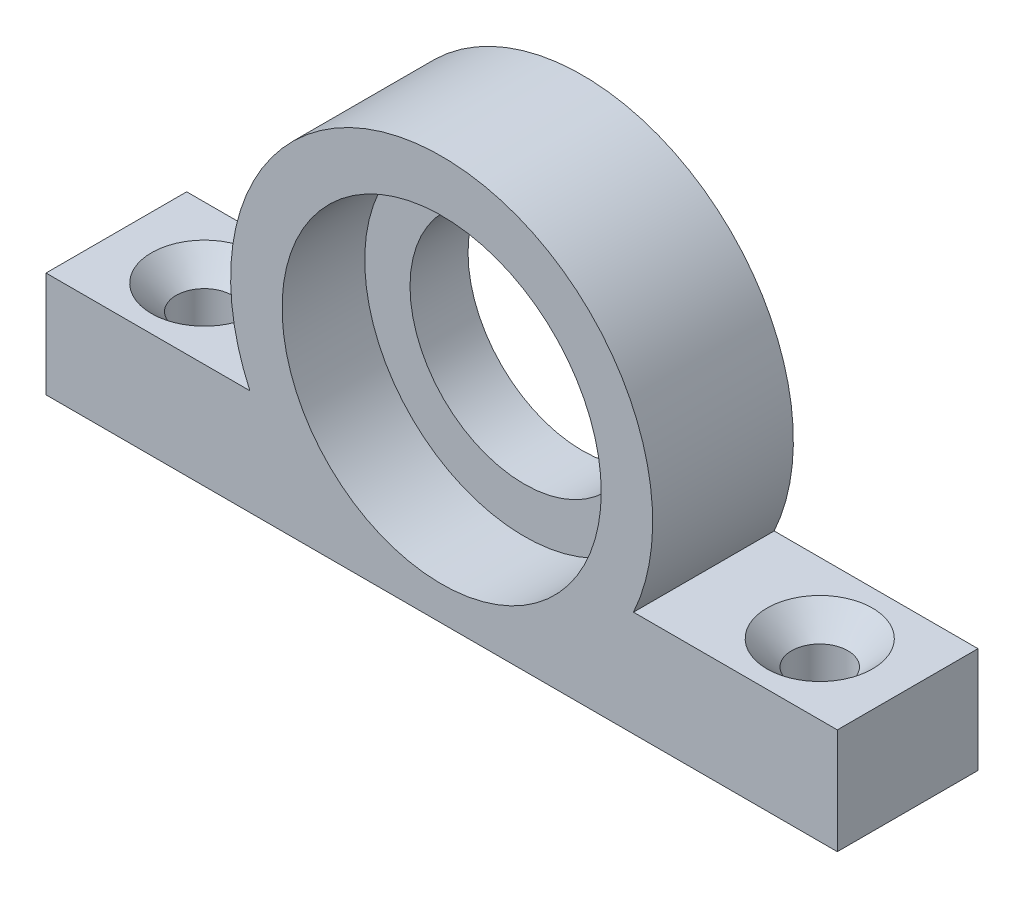
ISO-10303-21;
HEADER;
FILE_DESCRIPTION(('STEP AP214'),'2;1');
FILE_NAME('part.step','',(''),(''),'','','');
FILE_SCHEMA(('AUTOMOTIVE_DESIGN { 1 0 10303 214 1 1 1 1 }'));
ENDSEC;
DATA;
#1=APPLICATION_CONTEXT('core data for automotive mechanical design processes');
#2=APPLICATION_PROTOCOL_DEFINITION('international standard','automotive_design',2000,#1);
#3=PRODUCT_CONTEXT('',#1,'mechanical');
#4=PRODUCT('Part','Part','',(#3));
#5=PRODUCT_RELATED_PRODUCT_CATEGORY('part','',(#4));
#6=PRODUCT_DEFINITION_FORMATION('','',#4);
#7=PRODUCT_DEFINITION_CONTEXT('part definition',#1,'design');
#8=PRODUCT_DEFINITION('design','',#6,#7);
#9=PRODUCT_DEFINITION_SHAPE('','',#8);
#10=(LENGTH_UNIT() NAMED_UNIT(*) SI_UNIT(.MILLI.,.METRE.));
#11=(NAMED_UNIT(*) PLANE_ANGLE_UNIT() SI_UNIT($,.RADIAN.));
#12=(NAMED_UNIT(*) SI_UNIT($,.STERADIAN.) SOLID_ANGLE_UNIT());
#13=UNCERTAINTY_MEASURE_WITH_UNIT(LENGTH_MEASURE(1.E-05),#10,'distance_accuracy_value','');
#14=(GEOMETRIC_REPRESENTATION_CONTEXT(3) GLOBAL_UNCERTAINTY_ASSIGNED_CONTEXT((#13)) GLOBAL_UNIT_ASSIGNED_CONTEXT((#10,
#11,#12)) REPRESENTATION_CONTEXT('',''));
#15=CARTESIAN_POINT('',(0.,0.,0.));
#16=DIRECTION('',(0.,0.,1.));
#17=DIRECTION('',(1.,0.,0.));
#18=AXIS2_PLACEMENT_3D('',#15,#16,#17);
#19=CARTESIAN_POINT('',(-22.5,11.,8.));
#20=DIRECTION('',(0.,0.,-1.));
#21=DIRECTION('',(-1.,0.,0.));
#22=AXIS2_PLACEMENT_3D('',#19,#20,#21);
#23=CYLINDRICAL_SURFACE('',#22,6.50000000000001);
#24=CARTESIAN_POINT('',(-22.5,11.,0.));
#25=DIRECTION('',(0.,0.,1.));
#26=DIRECTION('',(1.,0.,0.));
#27=AXIS2_PLACEMENT_3D('',#24,#25,#26);
#28=CIRCLE('',#27,6.50000000000001);
#29=CARTESIAN_POINT('',(-16.,11.,0.));
#30=VERTEX_POINT('',#29);
#31=EDGE_CURVE('E151',#30,#30,#28,.T.);
#32=ORIENTED_EDGE('',*,*,#31,.F.);
#33=EDGE_LOOP('',(#32));
#34=FACE_BOUND('',#33,.T.);
#35=CARTESIAN_POINT('',(-22.5,11.,3.3));
#36=DIRECTION('',(0.,0.,1.));
#37=DIRECTION('',(1.,0.,0.));
#38=AXIS2_PLACEMENT_3D('',#35,#36,#37);
#39=CIRCLE('',#38,6.50000000000001);
#40=CARTESIAN_POINT('',(-16.,11.,3.3));
#41=VERTEX_POINT('',#40);
#42=EDGE_CURVE('E45',#41,#41,#39,.T.);
#43=ORIENTED_EDGE('',*,*,#42,.T.);
#44=EDGE_LOOP('',(#43));
#45=FACE_BOUND('',#44,.T.);
#46=ADVANCED_FACE('F41',(#34,#45),#23,.F.);
#47=CARTESIAN_POINT('',(-22.5,11.,8.));
#48=DIRECTION('',(0.,0.,-1.));
#49=DIRECTION('',(-1.,0.,0.));
#50=AXIS2_PLACEMENT_3D('',#47,#48,#49);
#51=CYLINDRICAL_SURFACE('',#50,12.);
#52=CARTESIAN_POINT('',(-22.5,11.,0.));
#53=DIRECTION('',(0.,0.,1.));
#54=DIRECTION('',(1.,0.,0.));
#55=AXIS2_PLACEMENT_3D('',#52,#53,#54);
#56=CIRCLE('',#55,12.);
#57=CARTESIAN_POINT('',(-11.5912878853643,6.,0.));
#58=VERTEX_POINT('',#57);
#59=CARTESIAN_POINT('',(-33.4087121146357,5.99999999999999,0.));
#60=VERTEX_POINT('',#59);
#61=EDGE_CURVE('E133',#58,#60,#56,.T.);
#62=ORIENTED_EDGE('',*,*,#61,.T.);
#63=DIRECTION('',(0.,0.,-1.));
#64=VECTOR('',#63,1.);
#65=CARTESIAN_POINT('',(-33.4087121146357,5.99999999999999,8.));
#66=LINE('',#65,#64);
#67=CARTESIAN_POINT('',(-33.4087121146357,5.99999999999999,8.));
#68=VERTEX_POINT('',#67);
#69=EDGE_CURVE('E11',#68,#60,#66,.T.);
#70=ORIENTED_EDGE('',*,*,#69,.F.);
#71=CARTESIAN_POINT('',(-22.5,11.,8.));
#72=DIRECTION('',(0.,0.,1.));
#73=DIRECTION('',(1.,0.,0.));
#74=AXIS2_PLACEMENT_3D('',#71,#72,#73);
#75=CIRCLE('',#74,12.);
#76=CARTESIAN_POINT('',(-11.5912878853643,6.,8.));
#77=VERTEX_POINT('',#76);
#78=EDGE_CURVE('E155',#77,#68,#75,.T.);
#79=ORIENTED_EDGE('',*,*,#78,.F.);
#80=DIRECTION('',(0.,0.,-1.));
#81=VECTOR('',#80,1.);
#82=CARTESIAN_POINT('',(-11.5912878853643,6.,8.));
#83=LINE('',#82,#81);
#84=EDGE_CURVE('E132',#77,#58,#83,.T.);
#85=ORIENTED_EDGE('',*,*,#84,.T.);
#86=EDGE_LOOP('',(#62,#70,#79,#85));
#87=FACE_BOUND('',#86,.T.);
#88=ADVANCED_FACE('F43',(#87),#51,.T.);
#89=CARTESIAN_POINT('',(0.,6.,8.));
#90=DIRECTION('',(0.,-1.,0.));
#91=DIRECTION('',(1.,0.,0.));
#92=AXIS2_PLACEMENT_3D('',#89,#90,#91);
#93=PLANE('',#92);
#94=CARTESIAN_POINT('',(-40.,5.99999999999999,4.));
#95=DIRECTION('',(0.,1.,0.));
#96=DIRECTION('',(0.,0.,1.));
#97=AXIS2_PLACEMENT_3D('',#94,#95,#96);
#98=CIRCLE('',#97,3.);
#99=CARTESIAN_POINT('',(-40.,5.99999999999999,7.));
#100=VERTEX_POINT('',#99);
#101=EDGE_CURVE('E228',#100,#100,#98,.T.);
#102=ORIENTED_EDGE('',*,*,#101,.F.);
#103=EDGE_LOOP('',(#102));
#104=FACE_BOUND('',#103,.T.);
#105=DIRECTION('',(-1.,0.,0.));
#106=VECTOR('',#105,1.);
#107=CARTESIAN_POINT('',(0.,6.,0.));
#108=LINE('',#107,#106);
#109=CARTESIAN_POINT('',(-45.,5.99999999999999,0.));
#110=VERTEX_POINT('',#109);
#111=EDGE_CURVE('E137',#60,#110,#108,.T.);
#112=ORIENTED_EDGE('',*,*,#111,.T.);
#113=DIRECTION('',(0.,0.,-1.));
#114=VECTOR('',#113,1.);
#115=CARTESIAN_POINT('',(-45.,5.99999999999999,8.));
#116=LINE('',#115,#114);
#117=CARTESIAN_POINT('',(-45.,5.99999999999999,8.));
#118=VERTEX_POINT('',#117);
#119=EDGE_CURVE('E52',#118,#110,#116,.T.);
#120=ORIENTED_EDGE('',*,*,#119,.F.);
#121=DIRECTION('',(-1.,0.,0.));
#122=VECTOR('',#121,1.);
#123=CARTESIAN_POINT('',(0.,6.,8.));
#124=LINE('',#123,#122);
#125=EDGE_CURVE('E96',#68,#118,#124,.T.);
#126=ORIENTED_EDGE('',*,*,#125,.F.);
#127=ORIENTED_EDGE('',*,*,#69,.T.);
#128=EDGE_LOOP('',(#112,#120,#126,#127));
#129=FACE_BOUND('',#128,.T.);
#130=ADVANCED_FACE('F166',(#104,#129),#93,.F.);
#131=CARTESIAN_POINT('',(-45.,0.,8.));
#132=DIRECTION('',(-1.,0.,0.));
#133=DIRECTION('',(0.,0.,1.));
#134=AXIS2_PLACEMENT_3D('',#131,#132,#133);
#135=PLANE('',#134);
#136=DIRECTION('',(0.,1.,0.));
#137=VECTOR('',#136,1.);
#138=CARTESIAN_POINT('',(-45.,0.,0.));
#139=LINE('',#138,#137);
#140=CARTESIAN_POINT('',(-45.,0.,0.));
#141=VERTEX_POINT('',#140);
#142=EDGE_CURVE('E141',#141,#110,#139,.T.);
#143=ORIENTED_EDGE('',*,*,#142,.F.);
#144=DIRECTION('',(0.,0.,-1.));
#145=VECTOR('',#144,1.);
#146=CARTESIAN_POINT('',(-45.,0.,8.));
#147=LINE('',#146,#145);
#148=CARTESIAN_POINT('',(-45.,0.,8.));
#149=VERTEX_POINT('',#148);
#150=EDGE_CURVE('E113',#149,#141,#147,.T.);
#151=ORIENTED_EDGE('',*,*,#150,.F.);
#152=DIRECTION('',(0.,1.,0.));
#153=VECTOR('',#152,1.);
#154=CARTESIAN_POINT('',(-45.,0.,8.));
#155=LINE('',#154,#153);
#156=EDGE_CURVE('E123',#149,#118,#155,.T.);
#157=ORIENTED_EDGE('',*,*,#156,.T.);
#158=ORIENTED_EDGE('',*,*,#119,.T.);
#159=EDGE_LOOP('',(#143,#151,#157,#158));
#160=FACE_BOUND('',#159,.T.);
#161=ADVANCED_FACE('F165',(#160),#135,.T.);
#162=CARTESIAN_POINT('',(0.,0.,8.));
#163=DIRECTION('',(0.,-1.,0.));
#164=DIRECTION('',(1.,0.,0.));
#165=AXIS2_PLACEMENT_3D('',#162,#163,#164);
#166=PLANE('',#165);
#167=CARTESIAN_POINT('',(-40.,0.,4.));
#168=DIRECTION('',(0.,1.,0.));
#169=DIRECTION('',(0.,0.,1.));
#170=AXIS2_PLACEMENT_3D('',#167,#168,#169);
#171=CIRCLE('',#170,1.6);
#172=CARTESIAN_POINT('',(-40.,0.,5.6));
#173=VERTEX_POINT('',#172);
#174=EDGE_CURVE('E233',#173,#173,#171,.T.);
#175=ORIENTED_EDGE('',*,*,#174,.T.);
#176=EDGE_LOOP('',(#175));
#177=FACE_BOUND('',#176,.T.);
#178=CARTESIAN_POINT('',(-5.,0.,4.));
#179=DIRECTION('',(0.,1.,0.));
#180=DIRECTION('',(0.,0.,1.));
#181=AXIS2_PLACEMENT_3D('',#178,#179,#180);
#182=CIRCLE('',#181,1.6);
#183=CARTESIAN_POINT('',(-5.,0.,5.6));
#184=VERTEX_POINT('',#183);
#185=EDGE_CURVE('E247',#184,#184,#182,.T.);
#186=ORIENTED_EDGE('',*,*,#185,.T.);
#187=EDGE_LOOP('',(#186));
#188=FACE_BOUND('',#187,.T.);
#189=DIRECTION('',(-1.,0.,0.));
#190=VECTOR('',#189,1.);
#191=CARTESIAN_POINT('',(0.,0.,0.));
#192=LINE('',#191,#190);
#193=CARTESIAN_POINT('',(0.,0.,0.));
#194=VERTEX_POINT('',#193);
#195=EDGE_CURVE('E111',#194,#141,#192,.T.);
#196=ORIENTED_EDGE('',*,*,#195,.F.);
#197=DIRECTION('',(0.,0.,-1.));
#198=VECTOR('',#197,1.);
#199=CARTESIAN_POINT('',(0.,0.,8.));
#200=LINE('',#199,#198);
#201=CARTESIAN_POINT('',(0.,0.,8.));
#202=VERTEX_POINT('',#201);
#203=EDGE_CURVE('E105',#202,#194,#200,.T.);
#204=ORIENTED_EDGE('',*,*,#203,.F.);
#205=DIRECTION('',(-1.,0.,0.));
#206=VECTOR('',#205,1.);
#207=CARTESIAN_POINT('',(0.,0.,8.));
#208=LINE('',#207,#206);
#209=EDGE_CURVE('E109',#202,#149,#208,.T.);
#210=ORIENTED_EDGE('',*,*,#209,.T.);
#211=ORIENTED_EDGE('',*,*,#150,.T.);
#212=EDGE_LOOP('',(#196,#204,#210,#211));
#213=FACE_BOUND('',#212,.T.);
#214=ADVANCED_FACE('F107',(#177,#188,#213),#166,.T.);
#215=CARTESIAN_POINT('',(0.,0.,8.));
#216=DIRECTION('',(-1.,0.,0.));
#217=DIRECTION('',(0.,0.,1.));
#218=AXIS2_PLACEMENT_3D('',#215,#216,#217);
#219=PLANE('',#218);
#220=DIRECTION('',(0.,1.,0.));
#221=VECTOR('',#220,1.);
#222=CARTESIAN_POINT('',(0.,0.,0.));
#223=LINE('',#222,#221);
#224=CARTESIAN_POINT('',(0.,6.,0.));
#225=VERTEX_POINT('',#224);
#226=EDGE_CURVE('E82',#194,#225,#223,.T.);
#227=ORIENTED_EDGE('',*,*,#226,.T.);
#228=DIRECTION('',(0.,0.,-1.));
#229=VECTOR('',#228,1.);
#230=CARTESIAN_POINT('',(0.,6.,8.));
#231=LINE('',#230,#229);
#232=CARTESIAN_POINT('',(0.,6.,8.));
#233=VERTEX_POINT('',#232);
#234=EDGE_CURVE('E114',#233,#225,#231,.T.);
#235=ORIENTED_EDGE('',*,*,#234,.F.);
#236=DIRECTION('',(0.,1.,0.));
#237=VECTOR('',#236,1.);
#238=CARTESIAN_POINT('',(0.,0.,8.));
#239=LINE('',#238,#237);
#240=EDGE_CURVE('E116',#202,#233,#239,.T.);
#241=ORIENTED_EDGE('',*,*,#240,.F.);
#242=ORIENTED_EDGE('',*,*,#203,.T.);
#243=EDGE_LOOP('',(#227,#235,#241,#242));
#244=FACE_BOUND('',#243,.T.);
#245=ADVANCED_FACE('F117',(#244),#219,.F.);
#246=CARTESIAN_POINT('',(0.,6.,8.));
#247=DIRECTION('',(0.,-1.,0.));
#248=DIRECTION('',(1.,0.,0.));
#249=AXIS2_PLACEMENT_3D('',#246,#247,#248);
#250=PLANE('',#249);
#251=CARTESIAN_POINT('',(-5.,6.,4.));
#252=DIRECTION('',(0.,1.,0.));
#253=DIRECTION('',(0.,0.,1.));
#254=AXIS2_PLACEMENT_3D('',#251,#252,#253);
#255=CIRCLE('',#254,3.);
#256=CARTESIAN_POINT('',(-5.,6.,7.));
#257=VERTEX_POINT('',#256);
#258=EDGE_CURVE('E239',#257,#257,#255,.T.);
#259=ORIENTED_EDGE('',*,*,#258,.F.);
#260=EDGE_LOOP('',(#259));
#261=FACE_BOUND('',#260,.T.);
#262=DIRECTION('',(-1.,0.,0.));
#263=VECTOR('',#262,1.);
#264=CARTESIAN_POINT('',(0.,6.,0.));
#265=LINE('',#264,#263);
#266=EDGE_CURVE('E88',#225,#58,#265,.T.);
#267=ORIENTED_EDGE('',*,*,#266,.T.);
#268=ORIENTED_EDGE('',*,*,#84,.F.);
#269=DIRECTION('',(-1.,0.,0.));
#270=VECTOR('',#269,1.);
#271=CARTESIAN_POINT('',(0.,6.,8.));
#272=LINE('',#271,#270);
#273=EDGE_CURVE('E60',#233,#77,#272,.T.);
#274=ORIENTED_EDGE('',*,*,#273,.F.);
#275=ORIENTED_EDGE('',*,*,#234,.T.);
#276=EDGE_LOOP('',(#267,#268,#274,#275));
#277=FACE_BOUND('',#276,.T.);
#278=ADVANCED_FACE('F174',(#261,#277),#250,.F.);
#279=CARTESIAN_POINT('',(0.,0.,8.));
#280=DIRECTION('',(0.,0.,1.));
#281=DIRECTION('',(1.,0.,0.));
#282=AXIS2_PLACEMENT_3D('',#279,#280,#281);
#283=PLANE('',#282);
#284=CARTESIAN_POINT('',(-22.5,11.,8.));
#285=DIRECTION('',(0.,0.,1.));
#286=DIRECTION('',(1.,0.,0.));
#287=AXIS2_PLACEMENT_3D('',#284,#285,#286);
#288=CIRCLE('',#287,9.075);
#289=CARTESIAN_POINT('',(-13.425,11.,8.));
#290=VERTEX_POINT('',#289);
#291=EDGE_CURVE('E251',#290,#290,#288,.T.);
#292=ORIENTED_EDGE('',*,*,#291,.F.);
#293=EDGE_LOOP('',(#292));
#294=FACE_BOUND('',#293,.T.);
#295=ORIENTED_EDGE('',*,*,#78,.T.);
#296=ORIENTED_EDGE('',*,*,#125,.T.);
#297=ORIENTED_EDGE('',*,*,#156,.F.);
#298=ORIENTED_EDGE('',*,*,#209,.F.);
#299=ORIENTED_EDGE('',*,*,#240,.T.);
#300=ORIENTED_EDGE('',*,*,#273,.T.);
#301=EDGE_LOOP('',(#295,#296,#297,#298,#299,#300));
#302=FACE_BOUND('',#301,.T.);
#303=ADVANCED_FACE('F121',(#294,#302),#283,.T.);
#304=CARTESIAN_POINT('',(0.,0.,0.));
#305=DIRECTION('',(0.,0.,1.));
#306=DIRECTION('',(1.,0.,0.));
#307=AXIS2_PLACEMENT_3D('',#304,#305,#306);
#308=PLANE('',#307);
#309=ORIENTED_EDGE('',*,*,#61,.F.);
#310=ORIENTED_EDGE('',*,*,#266,.F.);
#311=ORIENTED_EDGE('',*,*,#226,.F.);
#312=ORIENTED_EDGE('',*,*,#195,.T.);
#313=ORIENTED_EDGE('',*,*,#142,.T.);
#314=ORIENTED_EDGE('',*,*,#111,.F.);
#315=EDGE_LOOP('',(#309,#310,#311,#312,#313,#314));
#316=FACE_BOUND('',#315,.T.);
#317=ORIENTED_EDGE('',*,*,#31,.T.);
#318=EDGE_LOOP('',(#317));
#319=FACE_BOUND('',#318,.T.);
#320=ADVANCED_FACE('F170',(#316,#319),#308,.F.);
#321=CARTESIAN_POINT('',(-22.5,11.,3.3));
#322=DIRECTION('',(0.,0.,1.));
#323=DIRECTION('',(1.,0.,0.));
#324=AXIS2_PLACEMENT_3D('',#321,#322,#323);
#325=CYLINDRICAL_SURFACE('',#324,9.075);
#326=CARTESIAN_POINT('',(-22.5,11.,3.3));
#327=DIRECTION('',(0.,0.,1.));
#328=DIRECTION('',(1.,0.,0.));
#329=AXIS2_PLACEMENT_3D('',#326,#327,#328);
#330=CIRCLE('',#329,9.075);
#331=CARTESIAN_POINT('',(-13.425,11.,3.3));
#332=VERTEX_POINT('',#331);
#333=EDGE_CURVE('E252',#332,#332,#330,.T.);
#334=ORIENTED_EDGE('',*,*,#333,.F.);
#335=EDGE_LOOP('',(#334));
#336=FACE_BOUND('',#335,.T.);
#337=ORIENTED_EDGE('',*,*,#291,.T.);
#338=EDGE_LOOP('',(#337));
#339=FACE_BOUND('',#338,.T.);
#340=ADVANCED_FACE('F196',(#336,#339),#325,.F.);
#341=CARTESIAN_POINT('',(-22.5,11.,3.3));
#342=DIRECTION('',(0.,0.,1.));
#343=DIRECTION('',(1.,0.,0.));
#344=AXIS2_PLACEMENT_3D('',#341,#342,#343);
#345=PLANE('',#344);
#346=ORIENTED_EDGE('',*,*,#42,.F.);
#347=EDGE_LOOP('',(#346));
#348=FACE_BOUND('',#347,.T.);
#349=ORIENTED_EDGE('',*,*,#333,.T.);
#350=EDGE_LOOP('',(#349));
#351=FACE_BOUND('',#350,.T.);
#352=ADVANCED_FACE('F200',(#348,#351),#345,.T.);
#353=CARTESIAN_POINT('',(-5.,6.,4.));
#354=DIRECTION('',(0.,1.,0.));
#355=DIRECTION('',(0.,0.,1.));
#356=AXIS2_PLACEMENT_3D('',#353,#354,#355);
#357=CYLINDRICAL_SURFACE('',#356,1.6);
#358=ORIENTED_EDGE('',*,*,#185,.F.);
#359=EDGE_LOOP('',(#358));
#360=FACE_BOUND('',#359,.T.);
#361=CARTESIAN_POINT('',(-5.,4.6,4.));
#362=DIRECTION('',(0.,1.,0.));
#363=DIRECTION('',(0.,0.,1.));
#364=AXIS2_PLACEMENT_3D('',#361,#362,#363);
#365=CIRCLE('',#364,1.6);
#366=CARTESIAN_POINT('',(-5.,4.6,5.6));
#367=VERTEX_POINT('',#366);
#368=EDGE_CURVE('E243',#367,#367,#365,.T.);
#369=ORIENTED_EDGE('',*,*,#368,.T.);
#370=EDGE_LOOP('',(#369));
#371=FACE_BOUND('',#370,.T.);
#372=ADVANCED_FACE('F204',(#360,#371),#357,.F.);
#373=CARTESIAN_POINT('',(-5.,6.,4.));
#374=DIRECTION('',(0.,1.,0.));
#375=DIRECTION('',(0.,0.,1.));
#376=AXIS2_PLACEMENT_3D('',#373,#374,#375);
#377=CONICAL_SURFACE('',#376,3.,0.785398163397449);
#378=ORIENTED_EDGE('',*,*,#368,.F.);
#379=EDGE_LOOP('',(#378));
#380=FACE_BOUND('',#379,.T.);
#381=ORIENTED_EDGE('',*,*,#258,.T.);
#382=EDGE_LOOP('',(#381));
#383=FACE_BOUND('',#382,.T.);
#384=ADVANCED_FACE('F208',(#380,#383),#377,.F.);
#385=CARTESIAN_POINT('',(-40.,5.99999999999999,4.));
#386=DIRECTION('',(0.,1.,0.));
#387=DIRECTION('',(0.,0.,1.));
#388=AXIS2_PLACEMENT_3D('',#385,#386,#387);
#389=CYLINDRICAL_SURFACE('',#388,1.6);
#390=ORIENTED_EDGE('',*,*,#174,.F.);
#391=EDGE_LOOP('',(#390));
#392=FACE_BOUND('',#391,.T.);
#393=CARTESIAN_POINT('',(-40.,4.6,4.));
#394=DIRECTION('',(0.,1.,0.));
#395=DIRECTION('',(0.,0.,1.));
#396=AXIS2_PLACEMENT_3D('',#393,#394,#395);
#397=CIRCLE('',#396,1.6);
#398=CARTESIAN_POINT('',(-40.,4.6,5.6));
#399=VERTEX_POINT('',#398);
#400=EDGE_CURVE('E225',#399,#399,#397,.T.);
#401=ORIENTED_EDGE('',*,*,#400,.T.);
#402=EDGE_LOOP('',(#401));
#403=FACE_BOUND('',#402,.T.);
#404=ADVANCED_FACE('F212',(#392,#403),#389,.F.);
#405=CARTESIAN_POINT('',(-40.,5.99999999999999,4.));
#406=DIRECTION('',(0.,1.,0.));
#407=DIRECTION('',(0.,0.,1.));
#408=AXIS2_PLACEMENT_3D('',#405,#406,#407);
#409=CONICAL_SURFACE('',#408,3.,0.785398163397448);
#410=ORIENTED_EDGE('',*,*,#400,.F.);
#411=EDGE_LOOP('',(#410));
#412=FACE_BOUND('',#411,.T.);
#413=ORIENTED_EDGE('',*,*,#101,.T.);
#414=EDGE_LOOP('',(#413));
#415=FACE_BOUND('',#414,.T.);
#416=ADVANCED_FACE('F216',(#412,#415),#409,.F.);
#417=CLOSED_SHELL('',(#46,#88,#130,#161,#214,#245,#278,#303,#320,#340,#352,#372,#384,#404,#416));
#418=MANIFOLD_SOLID_BREP('B2',#417);
#419=ADVANCED_BREP_SHAPE_REPRESENTATION('',(#18,#418),#14);
#420=SHAPE_DEFINITION_REPRESENTATION(#9,#419);
ENDSEC;
END-ISO-10303-21;
